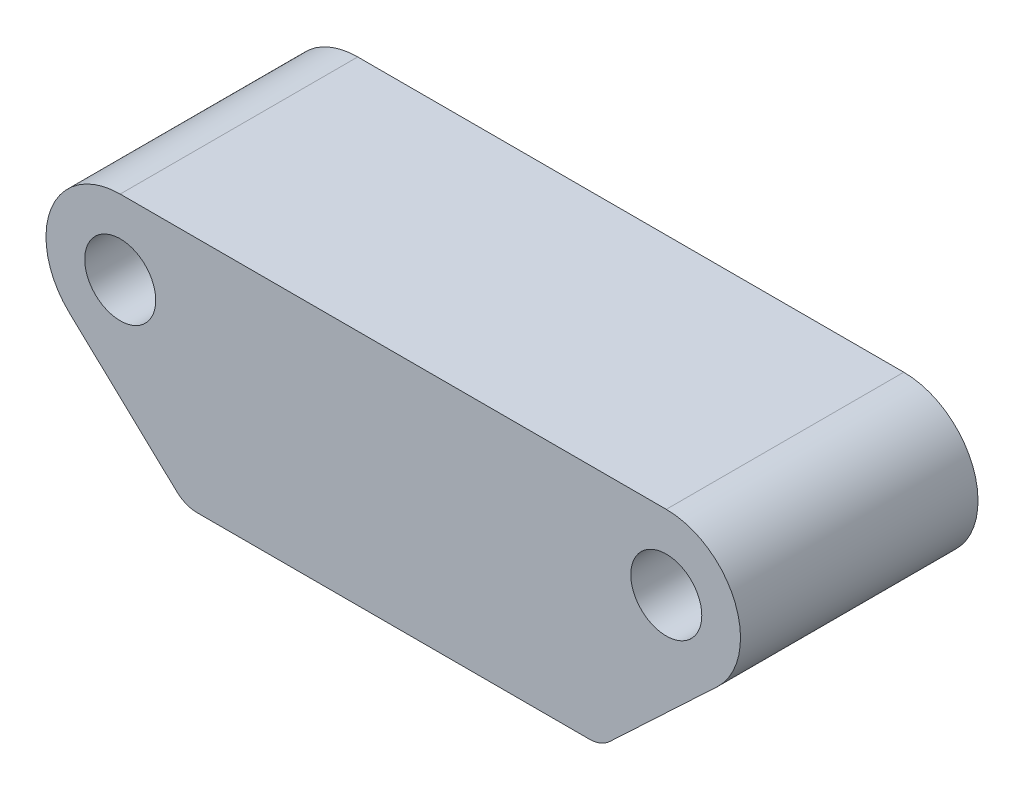
ISO-10303-21;
HEADER;
FILE_DESCRIPTION(('STEP AP214'),'2;1');
FILE_NAME('part.step','',(''),(''),'','','');
FILE_SCHEMA(('AUTOMOTIVE_DESIGN { 1 0 10303 214 1 1 1 1 }'));
ENDSEC;
DATA;
#1=APPLICATION_CONTEXT('core data for automotive mechanical design processes');
#2=APPLICATION_PROTOCOL_DEFINITION('international standard','automotive_design',2000,#1);
#3=PRODUCT_CONTEXT('',#1,'mechanical');
#4=PRODUCT('Part','Part','',(#3));
#5=PRODUCT_RELATED_PRODUCT_CATEGORY('part','',(#4));
#6=PRODUCT_DEFINITION_FORMATION('','',#4);
#7=PRODUCT_DEFINITION_CONTEXT('part definition',#1,'design');
#8=PRODUCT_DEFINITION('design','',#6,#7);
#9=PRODUCT_DEFINITION_SHAPE('','',#8);
#10=(LENGTH_UNIT() NAMED_UNIT(*) SI_UNIT(.MILLI.,.METRE.));
#11=(NAMED_UNIT(*) PLANE_ANGLE_UNIT() SI_UNIT($,.RADIAN.));
#12=(NAMED_UNIT(*) SI_UNIT($,.STERADIAN.) SOLID_ANGLE_UNIT());
#13=UNCERTAINTY_MEASURE_WITH_UNIT(LENGTH_MEASURE(1.E-05),#10,'distance_accuracy_value','');
#14=(GEOMETRIC_REPRESENTATION_CONTEXT(3) GLOBAL_UNCERTAINTY_ASSIGNED_CONTEXT((#13)) GLOBAL_UNIT_ASSIGNED_CONTEXT((#10,
#11,#12)) REPRESENTATION_CONTEXT('',''));
#15=CARTESIAN_POINT('',(0.,0.,0.));
#16=DIRECTION('',(0.,0.,1.));
#17=DIRECTION('',(1.,0.,0.));
#18=AXIS2_PLACEMENT_3D('',#15,#16,#17);
#19=CARTESIAN_POINT('',(14.59865,2.38125,0.));
#20=DIRECTION('',(0.,0.,-1.));
#21=DIRECTION('',(-1.,0.,0.));
#22=AXIS2_PLACEMENT_3D('',#19,#20,#21);
#23=PLANE('',#22);
#24=CARTESIAN_POINT('',(-14.59865,2.38125,0.));
#25=DIRECTION('',(0.,0.,1.));
#26=DIRECTION('',(1.,0.,0.));
#27=AXIS2_PLACEMENT_3D('',#24,#25,#26);
#28=CIRCLE('',#27,1.89865);
#29=CARTESIAN_POINT('',(-12.7,2.38125,0.));
#30=VERTEX_POINT('',#29);
#31=EDGE_CURVE('E177',#30,#30,#28,.T.);
#32=ORIENTED_EDGE('',*,*,#31,.T.);
#33=EDGE_LOOP('',(#32));
#34=FACE_BOUND('',#33,.T.);
#35=DIRECTION('',(0.728195003591173,0.685369999886815,0.));
#36=VECTOR('',#35,1.);
#37=CARTESIAN_POINT('',(17.3187121870508,-0.508773920502461,0.));
#38=LINE('',#37,#36);
#39=CARTESIAN_POINT('',(11.5709518969102,-5.91850956820098,0.));
#40=VERTEX_POINT('',#39);
#41=CARTESIAN_POINT('',(17.3187121870508,-0.508773920502459,0.));
#42=VERTEX_POINT('',#41);
#43=EDGE_CURVE('E157',#40,#42,#38,.T.);
#44=ORIENTED_EDGE('',*,*,#43,.F.);
#45=CARTESIAN_POINT('',(10.4829270220899,-4.7625,0.));
#46=DIRECTION('',(0.,0.,-1.));
#47=DIRECTION('',(-1.,0.,0.));
#48=AXIS2_PLACEMENT_3D('',#45,#46,#47);
#49=CIRCLE('',#48,1.5875);
#50=CARTESIAN_POINT('',(10.4829270220899,-6.35,0.));
#51=VERTEX_POINT('',#50);
#52=EDGE_CURVE('E132',#40,#51,#49,.T.);
#53=ORIENTED_EDGE('',*,*,#52,.T.);
#54=DIRECTION('',(1.,0.,0.));
#55=VECTOR('',#54,1.);
#56=CARTESIAN_POINT('',(-11.1125,-6.35,0.));
#57=LINE('',#56,#55);
#58=CARTESIAN_POINT('',(-10.4829270220899,-6.35,0.));
#59=VERTEX_POINT('',#58);
#60=EDGE_CURVE('E155',#59,#51,#57,.T.);
#61=ORIENTED_EDGE('',*,*,#60,.F.);
#62=CARTESIAN_POINT('',(-10.4829270220899,-4.7625,0.));
#63=DIRECTION('',(0.,0.,-1.));
#64=DIRECTION('',(-1.,0.,0.));
#65=AXIS2_PLACEMENT_3D('',#62,#63,#64);
#66=CIRCLE('',#65,1.5875);
#67=CARTESIAN_POINT('',(-11.5709518969102,-5.91850956820098,0.));
#68=VERTEX_POINT('',#67);
#69=EDGE_CURVE('E125',#59,#68,#66,.T.);
#70=ORIENTED_EDGE('',*,*,#69,.T.);
#71=DIRECTION('',(0.728195003591172,-0.685369999886815,0.));
#72=VECTOR('',#71,1.);
#73=CARTESIAN_POINT('',(-17.3187121870508,-0.508773920502465,0.));
#74=LINE('',#73,#72);
#75=CARTESIAN_POINT('',(-17.3187121870508,-0.508773920502465,0.));
#76=VERTEX_POINT('',#75);
#77=EDGE_CURVE('E160',#76,#68,#74,.T.);
#78=ORIENTED_EDGE('',*,*,#77,.F.);
#79=CARTESIAN_POINT('',(-14.59865,2.38125,0.));
#80=DIRECTION('',(0.,0.,1.));
#81=DIRECTION('',(1.,0.,0.));
#82=AXIS2_PLACEMENT_3D('',#79,#80,#81);
#83=CIRCLE('',#82,3.96875);
#84=CARTESIAN_POINT('',(-14.59865,6.35,0.));
#85=VERTEX_POINT('',#84);
#86=EDGE_CURVE('E164',#85,#76,#83,.T.);
#87=ORIENTED_EDGE('',*,*,#86,.F.);
#88=DIRECTION('',(-1.,0.,0.));
#89=VECTOR('',#88,1.);
#90=CARTESIAN_POINT('',(-12.7,6.35,0.));
#91=LINE('',#90,#89);
#92=CARTESIAN_POINT('',(14.59865,6.35,0.));
#93=VERTEX_POINT('',#92);
#94=EDGE_CURVE('E118',#93,#85,#91,.T.);
#95=ORIENTED_EDGE('',*,*,#94,.F.);
#96=CARTESIAN_POINT('',(14.59865,2.38125,0.));
#97=DIRECTION('',(0.,0.,1.));
#98=DIRECTION('',(-1.,0.,0.));
#99=AXIS2_PLACEMENT_3D('',#96,#97,#98);
#100=CIRCLE('',#99,3.96875);
#101=EDGE_CURVE('E162',#42,#93,#100,.T.);
#102=ORIENTED_EDGE('',*,*,#101,.F.);
#103=EDGE_LOOP('',(#44,#53,#61,#70,#78,#87,#95,#102));
#104=FACE_BOUND('',#103,.T.);
#105=CARTESIAN_POINT('',(14.59865,2.38125,0.));
#106=DIRECTION('',(0.,0.,1.));
#107=DIRECTION('',(1.,0.,0.));
#108=AXIS2_PLACEMENT_3D('',#105,#106,#107);
#109=CIRCLE('',#108,1.89865);
#110=CARTESIAN_POINT('',(16.4973,2.38125,0.));
#111=VERTEX_POINT('',#110);
#112=EDGE_CURVE('E184',#111,#111,#109,.T.);
#113=ORIENTED_EDGE('',*,*,#112,.T.);
#114=EDGE_LOOP('',(#113));
#115=FACE_BOUND('',#114,.T.);
#116=ADVANCED_FACE('F32',(#34,#104,#115),#23,.T.);
#117=CARTESIAN_POINT('',(14.59865,2.38125,12.7));
#118=DIRECTION('',(0.,0.,-1.));
#119=DIRECTION('',(-1.,0.,0.));
#120=AXIS2_PLACEMENT_3D('',#117,#118,#119);
#121=PLANE('',#120);
#122=CARTESIAN_POINT('',(14.59865,2.38125,12.7));
#123=DIRECTION('',(0.,0.,1.));
#124=DIRECTION('',(1.,0.,0.));
#125=AXIS2_PLACEMENT_3D('',#122,#123,#124);
#126=CIRCLE('',#125,1.89864999999999);
#127=CARTESIAN_POINT('',(16.4973,2.38125,12.7));
#128=VERTEX_POINT('',#127);
#129=EDGE_CURVE('E188',#128,#128,#126,.T.);
#130=ORIENTED_EDGE('',*,*,#129,.F.);
#131=EDGE_LOOP('',(#130));
#132=FACE_BOUND('',#131,.T.);
#133=DIRECTION('',(1.,0.,0.));
#134=VECTOR('',#133,1.);
#135=CARTESIAN_POINT('',(-11.1125,-6.35,12.7));
#136=LINE('',#135,#134);
#137=CARTESIAN_POINT('',(-10.4829270220899,-6.35,12.7));
#138=VERTEX_POINT('',#137);
#139=CARTESIAN_POINT('',(10.4829270220899,-6.35,12.7));
#140=VERTEX_POINT('',#139);
#141=EDGE_CURVE('E143',#138,#140,#136,.T.);
#142=ORIENTED_EDGE('',*,*,#141,.T.);
#143=CARTESIAN_POINT('',(10.4829270220899,-4.7625,12.7));
#144=DIRECTION('',(0.,0.,-1.));
#145=DIRECTION('',(-1.,0.,0.));
#146=AXIS2_PLACEMENT_3D('',#143,#144,#145);
#147=CIRCLE('',#146,1.5875);
#148=CARTESIAN_POINT('',(11.5709518969102,-5.91850956820098,12.7));
#149=VERTEX_POINT('',#148);
#150=EDGE_CURVE('E40',#140,#149,#147,.F.);
#151=ORIENTED_EDGE('',*,*,#150,.T.);
#152=DIRECTION('',(0.728195003591173,0.685369999886815,0.));
#153=VECTOR('',#152,1.);
#154=CARTESIAN_POINT('',(17.3187121870508,-0.508773920502461,12.7));
#155=LINE('',#154,#153);
#156=CARTESIAN_POINT('',(17.3187121870508,-0.508773920502459,12.7));
#157=VERTEX_POINT('',#156);
#158=EDGE_CURVE('E141',#149,#157,#155,.T.);
#159=ORIENTED_EDGE('',*,*,#158,.T.);
#160=CARTESIAN_POINT('',(14.59865,2.38125,12.7));
#161=DIRECTION('',(0.,0.,1.));
#162=DIRECTION('',(-1.,0.,0.));
#163=AXIS2_PLACEMENT_3D('',#160,#161,#162);
#164=CIRCLE('',#163,3.96875);
#165=CARTESIAN_POINT('',(14.59865,6.35,12.7));
#166=VERTEX_POINT('',#165);
#167=EDGE_CURVE('E114',#157,#166,#164,.T.);
#168=ORIENTED_EDGE('',*,*,#167,.T.);
#169=DIRECTION('',(-1.,0.,0.));
#170=VECTOR('',#169,1.);
#171=CARTESIAN_POINT('',(-14.59865,6.35,12.7));
#172=LINE('',#171,#170);
#173=CARTESIAN_POINT('',(-14.59865,6.35,12.7));
#174=VERTEX_POINT('',#173);
#175=EDGE_CURVE('E108',#166,#174,#172,.T.);
#176=ORIENTED_EDGE('',*,*,#175,.T.);
#177=CARTESIAN_POINT('',(-14.59865,2.38125,12.7));
#178=DIRECTION('',(0.,0.,1.));
#179=DIRECTION('',(1.,0.,0.));
#180=AXIS2_PLACEMENT_3D('',#177,#178,#179);
#181=CIRCLE('',#180,3.96875);
#182=CARTESIAN_POINT('',(-17.3187121870508,-0.508773920502465,12.7));
#183=VERTEX_POINT('',#182);
#184=EDGE_CURVE('E99',#174,#183,#181,.T.);
#185=ORIENTED_EDGE('',*,*,#184,.T.);
#186=DIRECTION('',(0.728195003591172,-0.685369999886815,0.));
#187=VECTOR('',#186,1.);
#188=CARTESIAN_POINT('',(-17.3187121870508,-0.508773920502465,12.7));
#189=LINE('',#188,#187);
#190=CARTESIAN_POINT('',(-11.5709518969102,-5.91850956820098,12.7));
#191=VERTEX_POINT('',#190);
#192=EDGE_CURVE('E107',#183,#191,#189,.T.);
#193=ORIENTED_EDGE('',*,*,#192,.T.);
#194=CARTESIAN_POINT('',(-10.4829270220899,-4.7625,12.7));
#195=DIRECTION('',(0.,0.,-1.));
#196=DIRECTION('',(-1.,0.,0.));
#197=AXIS2_PLACEMENT_3D('',#194,#195,#196);
#198=CIRCLE('',#197,1.5875);
#199=EDGE_CURVE('E138',#191,#138,#198,.F.);
#200=ORIENTED_EDGE('',*,*,#199,.T.);
#201=EDGE_LOOP('',(#142,#151,#159,#168,#176,#185,#193,#200));
#202=FACE_BOUND('',#201,.T.);
#203=CARTESIAN_POINT('',(-14.59865,2.38125,12.7));
#204=DIRECTION('',(0.,0.,1.));
#205=DIRECTION('',(1.,0.,0.));
#206=AXIS2_PLACEMENT_3D('',#203,#204,#205);
#207=CIRCLE('',#206,1.89865);
#208=CARTESIAN_POINT('',(-12.7,2.38125,12.7));
#209=VERTEX_POINT('',#208);
#210=EDGE_CURVE('E175',#209,#209,#207,.T.);
#211=ORIENTED_EDGE('',*,*,#210,.F.);
#212=EDGE_LOOP('',(#211));
#213=FACE_BOUND('',#212,.T.);
#214=ADVANCED_FACE('F111',(#132,#202,#213),#121,.F.);
#215=CARTESIAN_POINT('',(-14.59865,2.38125,12.7));
#216=DIRECTION('',(0.,0.,-1.));
#217=DIRECTION('',(-1.,0.,0.));
#218=AXIS2_PLACEMENT_3D('',#215,#216,#217);
#219=CYLINDRICAL_SURFACE('',#218,3.96875);
#220=ORIENTED_EDGE('',*,*,#86,.T.);
#221=DIRECTION('',(0.,0.,-1.));
#222=VECTOR('',#221,1.);
#223=CARTESIAN_POINT('',(-17.3187121870508,-0.508773920502465,12.7));
#224=LINE('',#223,#222);
#225=EDGE_CURVE('E105',#183,#76,#224,.T.);
#226=ORIENTED_EDGE('',*,*,#225,.F.);
#227=ORIENTED_EDGE('',*,*,#184,.F.);
#228=DIRECTION('',(0.,0.,-1.));
#229=VECTOR('',#228,1.);
#230=CARTESIAN_POINT('',(-14.59865,6.35,12.7));
#231=LINE('',#230,#229);
#232=EDGE_CURVE('E103',#174,#85,#231,.T.);
#233=ORIENTED_EDGE('',*,*,#232,.T.);
#234=EDGE_LOOP('',(#220,#226,#227,#233));
#235=FACE_BOUND('',#234,.T.);
#236=ADVANCED_FACE('F101',(#235),#219,.T.);
#237=CARTESIAN_POINT('',(-17.3187121870508,-0.508773920502465,12.7));
#238=DIRECTION('',(0.685369999886815,0.728195003591172,0.));
#239=DIRECTION('',(-0.728195003591172,0.685369999886815,0.));
#240=AXIS2_PLACEMENT_3D('',#237,#238,#239);
#241=PLANE('',#240);
#242=ORIENTED_EDGE('',*,*,#77,.T.);
#243=DIRECTION('',(0.,0.,-1.));
#244=VECTOR('',#243,1.);
#245=CARTESIAN_POINT('',(-11.5709518969102,-5.91850956820098,12.7));
#246=LINE('',#245,#244);
#247=EDGE_CURVE('E11',#68,#191,#246,.F.);
#248=ORIENTED_EDGE('',*,*,#247,.T.);
#249=ORIENTED_EDGE('',*,*,#192,.F.);
#250=ORIENTED_EDGE('',*,*,#225,.T.);
#251=EDGE_LOOP('',(#242,#248,#249,#250));
#252=FACE_BOUND('',#251,.T.);
#253=ADVANCED_FACE('F200',(#252),#241,.F.);
#254=CARTESIAN_POINT('',(-11.1125,-6.35,12.7));
#255=DIRECTION('',(0.,1.,0.));
#256=DIRECTION('',(-1.,0.,0.));
#257=AXIS2_PLACEMENT_3D('',#254,#255,#256);
#258=PLANE('',#257);
#259=ORIENTED_EDGE('',*,*,#60,.T.);
#260=DIRECTION('',(0.,0.,-1.));
#261=VECTOR('',#260,1.);
#262=CARTESIAN_POINT('',(10.4829270220899,-6.35,12.7));
#263=LINE('',#262,#261);
#264=EDGE_CURVE('E53',#51,#140,#263,.F.);
#265=ORIENTED_EDGE('',*,*,#264,.T.);
#266=ORIENTED_EDGE('',*,*,#141,.F.);
#267=DIRECTION('',(0.,0.,-1.));
#268=VECTOR('',#267,1.);
#269=CARTESIAN_POINT('',(-10.4829270220899,-6.35,12.7));
#270=LINE('',#269,#268);
#271=EDGE_CURVE('E134',#138,#59,#270,.T.);
#272=ORIENTED_EDGE('',*,*,#271,.T.);
#273=EDGE_LOOP('',(#259,#265,#266,#272));
#274=FACE_BOUND('',#273,.T.);
#275=ADVANCED_FACE('F158',(#274),#258,.F.);
#276=CARTESIAN_POINT('',(17.3187121870508,-0.508773920502461,12.7));
#277=DIRECTION('',(-0.685369999886815,0.728195003591172,0.));
#278=DIRECTION('',(-0.728195003591173,-0.685369999886815,0.));
#279=AXIS2_PLACEMENT_3D('',#276,#277,#278);
#280=PLANE('',#279);
#281=ORIENTED_EDGE('',*,*,#158,.F.);
#282=DIRECTION('',(0.,0.,-1.));
#283=VECTOR('',#282,1.);
#284=CARTESIAN_POINT('',(11.5709518969102,-5.91850956820098,12.7));
#285=LINE('',#284,#283);
#286=EDGE_CURVE('E122',#149,#40,#285,.T.);
#287=ORIENTED_EDGE('',*,*,#286,.T.);
#288=ORIENTED_EDGE('',*,*,#43,.T.);
#289=DIRECTION('',(0.,0.,-1.));
#290=VECTOR('',#289,1.);
#291=CARTESIAN_POINT('',(17.3187121870508,-0.508773920502459,12.7));
#292=LINE('',#291,#290);
#293=EDGE_CURVE('E127',#157,#42,#292,.T.);
#294=ORIENTED_EDGE('',*,*,#293,.F.);
#295=EDGE_LOOP('',(#281,#287,#288,#294));
#296=FACE_BOUND('',#295,.T.);
#297=ADVANCED_FACE('F147',(#296),#280,.F.);
#298=CARTESIAN_POINT('',(14.59865,2.38125,12.7));
#299=DIRECTION('',(0.,0.,-1.));
#300=DIRECTION('',(-1.,0.,0.));
#301=AXIS2_PLACEMENT_3D('',#298,#299,#300);
#302=CYLINDRICAL_SURFACE('',#301,3.96875);
#303=ORIENTED_EDGE('',*,*,#101,.T.);
#304=DIRECTION('',(0.,0.,-1.));
#305=VECTOR('',#304,1.);
#306=CARTESIAN_POINT('',(14.59865,6.35,12.7));
#307=LINE('',#306,#305);
#308=EDGE_CURVE('E171',#166,#93,#307,.T.);
#309=ORIENTED_EDGE('',*,*,#308,.F.);
#310=ORIENTED_EDGE('',*,*,#167,.F.);
#311=ORIENTED_EDGE('',*,*,#293,.T.);
#312=EDGE_LOOP('',(#303,#309,#310,#311));
#313=FACE_BOUND('',#312,.T.);
#314=ADVANCED_FACE('F173',(#313),#302,.T.);
#315=CARTESIAN_POINT('',(-12.7,6.35,12.7));
#316=DIRECTION('',(0.,-1.,0.));
#317=DIRECTION('',(0.,0.,-1.));
#318=AXIS2_PLACEMENT_3D('',#315,#316,#317);
#319=PLANE('',#318);
#320=ORIENTED_EDGE('',*,*,#94,.T.);
#321=ORIENTED_EDGE('',*,*,#232,.F.);
#322=ORIENTED_EDGE('',*,*,#175,.F.);
#323=ORIENTED_EDGE('',*,*,#308,.T.);
#324=EDGE_LOOP('',(#320,#321,#322,#323));
#325=FACE_BOUND('',#324,.T.);
#326=ADVANCED_FACE('F120',(#325),#319,.F.);
#327=CARTESIAN_POINT('',(-14.59865,2.38125,12.7));
#328=DIRECTION('',(0.,0.,-1.));
#329=DIRECTION('',(-1.,0.,0.));
#330=AXIS2_PLACEMENT_3D('',#327,#328,#329);
#331=CYLINDRICAL_SURFACE('',#330,1.89865);
#332=ORIENTED_EDGE('',*,*,#210,.T.);
#333=EDGE_LOOP('',(#332));
#334=FACE_BOUND('',#333,.T.);
#335=ORIENTED_EDGE('',*,*,#31,.F.);
#336=EDGE_LOOP('',(#335));
#337=FACE_BOUND('',#336,.T.);
#338=ADVANCED_FACE('F205',(#334,#337),#331,.F.);
#339=CARTESIAN_POINT('',(10.4829270220899,-4.7625,12.7));
#340=DIRECTION('',(0.,0.,-1.));
#341=DIRECTION('',(-1.,0.,0.));
#342=AXIS2_PLACEMENT_3D('',#339,#340,#341);
#343=CYLINDRICAL_SURFACE('',#342,1.5875);
#344=ORIENTED_EDGE('',*,*,#150,.F.);
#345=ORIENTED_EDGE('',*,*,#264,.F.);
#346=ORIENTED_EDGE('',*,*,#52,.F.);
#347=ORIENTED_EDGE('',*,*,#286,.F.);
#348=EDGE_LOOP('',(#344,#345,#346,#347));
#349=FACE_BOUND('',#348,.T.);
#350=ADVANCED_FACE('F151',(#349),#343,.T.);
#351=CARTESIAN_POINT('',(-10.4829270220899,-4.7625,12.7));
#352=DIRECTION('',(0.,0.,-1.));
#353=DIRECTION('',(-1.,0.,0.));
#354=AXIS2_PLACEMENT_3D('',#351,#352,#353);
#355=CYLINDRICAL_SURFACE('',#354,1.5875);
#356=ORIENTED_EDGE('',*,*,#199,.F.);
#357=ORIENTED_EDGE('',*,*,#247,.F.);
#358=ORIENTED_EDGE('',*,*,#69,.F.);
#359=ORIENTED_EDGE('',*,*,#271,.F.);
#360=EDGE_LOOP('',(#356,#357,#358,#359));
#361=FACE_BOUND('',#360,.T.);
#362=ADVANCED_FACE('F34',(#361),#355,.T.);
#363=CARTESIAN_POINT('',(14.59865,2.38125,12.7));
#364=DIRECTION('',(0.,0.,1.));
#365=DIRECTION('',(1.,0.,0.));
#366=AXIS2_PLACEMENT_3D('',#363,#364,#365);
#367=CYLINDRICAL_SURFACE('',#366,1.89864999999999);
#368=ORIENTED_EDGE('',*,*,#112,.F.);
#369=EDGE_LOOP('',(#368));
#370=FACE_BOUND('',#369,.T.);
#371=ORIENTED_EDGE('',*,*,#129,.T.);
#372=EDGE_LOOP('',(#371));
#373=FACE_BOUND('',#372,.T.);
#374=ADVANCED_FACE('F192',(#370,#373),#367,.F.);
#375=CLOSED_SHELL('',(#116,#214,#236,#253,#275,#297,#314,#326,#338,#350,#362,#374));
#376=MANIFOLD_SOLID_BREP('B2',#375);
#377=ADVANCED_BREP_SHAPE_REPRESENTATION('',(#18,#376),#14);
#378=SHAPE_DEFINITION_REPRESENTATION(#9,#377);
ENDSEC;
END-ISO-10303-21;
